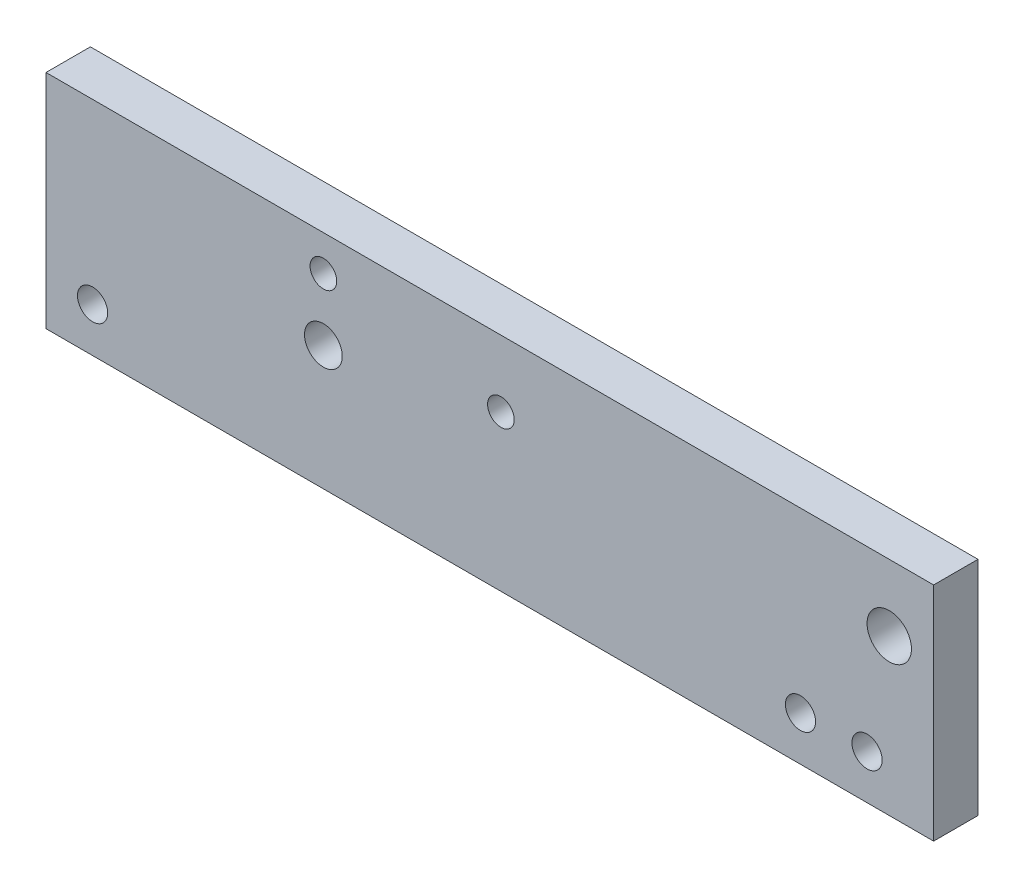
ISO-10303-21;
HEADER;
FILE_DESCRIPTION(('STEP AP214'),'2;1');
FILE_NAME('part.step','',(''),(''),'','','');
FILE_SCHEMA(('AUTOMOTIVE_DESIGN { 1 0 10303 214 1 1 1 1 }'));
ENDSEC;
DATA;
#1=APPLICATION_CONTEXT('core data for automotive mechanical design processes');
#2=APPLICATION_PROTOCOL_DEFINITION('international standard','automotive_design',2000,#1);
#3=PRODUCT_CONTEXT('',#1,'mechanical');
#4=PRODUCT('Part','Part','',(#3));
#5=PRODUCT_RELATED_PRODUCT_CATEGORY('part','',(#4));
#6=PRODUCT_DEFINITION_FORMATION('','',#4);
#7=PRODUCT_DEFINITION_CONTEXT('part definition',#1,'design');
#8=PRODUCT_DEFINITION('design','',#6,#7);
#9=PRODUCT_DEFINITION_SHAPE('','',#8);
#10=(LENGTH_UNIT() NAMED_UNIT(*) SI_UNIT(.MILLI.,.METRE.));
#11=(NAMED_UNIT(*) PLANE_ANGLE_UNIT() SI_UNIT($,.RADIAN.));
#12=(NAMED_UNIT(*) SI_UNIT($,.STERADIAN.) SOLID_ANGLE_UNIT());
#13=UNCERTAINTY_MEASURE_WITH_UNIT(LENGTH_MEASURE(1.E-05),#10,'distance_accuracy_value','');
#14=(GEOMETRIC_REPRESENTATION_CONTEXT(3) GLOBAL_UNCERTAINTY_ASSIGNED_CONTEXT((#13)) GLOBAL_UNIT_ASSIGNED_CONTEXT((#10,
#11,#12)) REPRESENTATION_CONTEXT('',''));
#15=CARTESIAN_POINT('',(0.,0.,0.));
#16=DIRECTION('',(0.,0.,1.));
#17=DIRECTION('',(1.,0.,0.));
#18=AXIS2_PLACEMENT_3D('',#15,#16,#17);
#19=CARTESIAN_POINT('',(-100.,-25.,10.));
#20=DIRECTION('',(1.,0.,0.));
#21=DIRECTION('',(0.,0.,-1.));
#22=AXIS2_PLACEMENT_3D('',#19,#20,#21);
#23=PLANE('',#22);
#24=DIRECTION('',(0.,-1.,0.));
#25=VECTOR('',#24,1.);
#26=CARTESIAN_POINT('',(-100.,-25.,0.));
#27=LINE('',#26,#25);
#28=CARTESIAN_POINT('',(-100.,25.,0.));
#29=VERTEX_POINT('',#28);
#30=CARTESIAN_POINT('',(-100.,-25.,0.));
#31=VERTEX_POINT('',#30);
#32=EDGE_CURVE('E116',#29,#31,#27,.T.);
#33=ORIENTED_EDGE('',*,*,#32,.T.);
#34=DIRECTION('',(0.,0.,-1.));
#35=VECTOR('',#34,1.);
#36=CARTESIAN_POINT('',(-100.,-25.,10.));
#37=LINE('',#36,#35);
#38=CARTESIAN_POINT('',(-100.,-25.,10.));
#39=VERTEX_POINT('',#38);
#40=EDGE_CURVE('E11',#39,#31,#37,.T.);
#41=ORIENTED_EDGE('',*,*,#40,.F.);
#42=DIRECTION('',(0.,-1.,0.));
#43=VECTOR('',#42,1.);
#44=CARTESIAN_POINT('',(-100.,-25.,10.));
#45=LINE('',#44,#43);
#46=CARTESIAN_POINT('',(-100.,25.,10.));
#47=VERTEX_POINT('',#46);
#48=EDGE_CURVE('E99',#47,#39,#45,.T.);
#49=ORIENTED_EDGE('',*,*,#48,.F.);
#50=DIRECTION('',(0.,0.,-1.));
#51=VECTOR('',#50,1.);
#52=CARTESIAN_POINT('',(-100.,25.,10.));
#53=LINE('',#52,#51);
#54=EDGE_CURVE('E112',#47,#29,#53,.T.);
#55=ORIENTED_EDGE('',*,*,#54,.T.);
#56=EDGE_LOOP('',(#33,#41,#49,#55));
#57=FACE_BOUND('',#56,.T.);
#58=ADVANCED_FACE('F47',(#57),#23,.F.);
#59=CARTESIAN_POINT('',(100.,-25.,10.));
#60=DIRECTION('',(0.,1.,0.));
#61=DIRECTION('',(-1.,0.,0.));
#62=AXIS2_PLACEMENT_3D('',#59,#60,#61);
#63=PLANE('',#62);
#64=DIRECTION('',(1.,0.,0.));
#65=VECTOR('',#64,1.);
#66=CARTESIAN_POINT('',(100.,-25.,0.));
#67=LINE('',#66,#65);
#68=CARTESIAN_POINT('',(100.,-25.,0.));
#69=VERTEX_POINT('',#68);
#70=EDGE_CURVE('E104',#31,#69,#67,.T.);
#71=ORIENTED_EDGE('',*,*,#70,.T.);
#72=DIRECTION('',(0.,0.,-1.));
#73=VECTOR('',#72,1.);
#74=CARTESIAN_POINT('',(100.,-25.,10.));
#75=LINE('',#74,#73);
#76=CARTESIAN_POINT('',(100.,-25.,10.));
#77=VERTEX_POINT('',#76);
#78=EDGE_CURVE('E56',#77,#69,#75,.T.);
#79=ORIENTED_EDGE('',*,*,#78,.F.);
#80=DIRECTION('',(1.,0.,0.));
#81=VECTOR('',#80,1.);
#82=CARTESIAN_POINT('',(100.,-25.,10.));
#83=LINE('',#82,#81);
#84=EDGE_CURVE('E94',#39,#77,#83,.T.);
#85=ORIENTED_EDGE('',*,*,#84,.F.);
#86=ORIENTED_EDGE('',*,*,#40,.T.);
#87=EDGE_LOOP('',(#71,#79,#85,#86));
#88=FACE_BOUND('',#87,.T.);
#89=ADVANCED_FACE('F103',(#88),#63,.F.);
#90=CARTESIAN_POINT('',(100.,-25.,10.));
#91=DIRECTION('',(-1.,0.,0.));
#92=DIRECTION('',(0.,0.,1.));
#93=AXIS2_PLACEMENT_3D('',#90,#91,#92);
#94=PLANE('',#93);
#95=DIRECTION('',(0.,1.,0.));
#96=VECTOR('',#95,1.);
#97=CARTESIAN_POINT('',(100.,-25.,0.));
#98=LINE('',#97,#96);
#99=CARTESIAN_POINT('',(100.,25.,0.));
#100=VERTEX_POINT('',#99);
#101=EDGE_CURVE('E81',#69,#100,#98,.T.);
#102=ORIENTED_EDGE('',*,*,#101,.T.);
#103=DIRECTION('',(0.,0.,-1.));
#104=VECTOR('',#103,1.);
#105=CARTESIAN_POINT('',(100.,25.,10.));
#106=LINE('',#105,#104);
#107=CARTESIAN_POINT('',(100.,25.,10.));
#108=VERTEX_POINT('',#107);
#109=EDGE_CURVE('E106',#108,#100,#106,.T.);
#110=ORIENTED_EDGE('',*,*,#109,.F.);
#111=DIRECTION('',(0.,1.,0.));
#112=VECTOR('',#111,1.);
#113=CARTESIAN_POINT('',(100.,-25.,10.));
#114=LINE('',#113,#112);
#115=EDGE_CURVE('E97',#77,#108,#114,.T.);
#116=ORIENTED_EDGE('',*,*,#115,.F.);
#117=ORIENTED_EDGE('',*,*,#78,.T.);
#118=EDGE_LOOP('',(#102,#110,#116,#117));
#119=FACE_BOUND('',#118,.T.);
#120=ADVANCED_FACE('F107',(#119),#94,.F.);
#121=CARTESIAN_POINT('',(100.,25.,10.));
#122=DIRECTION('',(0.,-1.,0.));
#123=DIRECTION('',(1.,0.,0.));
#124=AXIS2_PLACEMENT_3D('',#121,#122,#123);
#125=PLANE('',#124);
#126=DIRECTION('',(-1.,0.,0.));
#127=VECTOR('',#126,1.);
#128=CARTESIAN_POINT('',(100.,25.,0.));
#129=LINE('',#128,#127);
#130=EDGE_CURVE('E87',#100,#29,#129,.T.);
#131=ORIENTED_EDGE('',*,*,#130,.T.);
#132=ORIENTED_EDGE('',*,*,#54,.F.);
#133=DIRECTION('',(-1.,0.,0.));
#134=VECTOR('',#133,1.);
#135=CARTESIAN_POINT('',(100.,25.,10.));
#136=LINE('',#135,#134);
#137=EDGE_CURVE('E64',#108,#47,#136,.T.);
#138=ORIENTED_EDGE('',*,*,#137,.F.);
#139=ORIENTED_EDGE('',*,*,#109,.T.);
#140=EDGE_LOOP('',(#131,#132,#138,#139));
#141=FACE_BOUND('',#140,.T.);
#142=ADVANCED_FACE('F131',(#141),#125,.F.);
#143=CARTESIAN_POINT('',(0.,0.,10.));
#144=DIRECTION('',(0.,0.,1.));
#145=DIRECTION('',(1.,0.,0.));
#146=AXIS2_PLACEMENT_3D('',#143,#144,#145);
#147=PLANE('',#146);
#148=CARTESIAN_POINT('',(-89.5,-15.,10.));
#149=DIRECTION('',(0.,0.,1.));
#150=DIRECTION('',(1.,0.,0.));
#151=AXIS2_PLACEMENT_3D('',#148,#149,#150);
#152=CIRCLE('',#151,3.4);
#153=CARTESIAN_POINT('',(-86.1,-15.,10.));
#154=VERTEX_POINT('',#153);
#155=EDGE_CURVE('E187',#154,#154,#152,.T.);
#156=ORIENTED_EDGE('',*,*,#155,.F.);
#157=EDGE_LOOP('',(#156));
#158=FACE_BOUND('',#157,.T.);
#159=CARTESIAN_POINT('',(70.,-15.,10.));
#160=DIRECTION('',(0.,0.,1.));
#161=DIRECTION('',(1.,0.,0.));
#162=AXIS2_PLACEMENT_3D('',#159,#160,#161);
#163=CIRCLE('',#162,3.4);
#164=CARTESIAN_POINT('',(73.4,-15.,10.));
#165=VERTEX_POINT('',#164);
#166=EDGE_CURVE('E183',#165,#165,#163,.T.);
#167=ORIENTED_EDGE('',*,*,#166,.F.);
#168=EDGE_LOOP('',(#167));
#169=FACE_BOUND('',#168,.T.);
#170=CARTESIAN_POINT('',(85.,-15.,10.));
#171=DIRECTION('',(0.,0.,1.));
#172=DIRECTION('',(1.,0.,0.));
#173=AXIS2_PLACEMENT_3D('',#170,#171,#172);
#174=CIRCLE('',#173,3.4);
#175=CARTESIAN_POINT('',(88.4,-15.,10.));
#176=VERTEX_POINT('',#175);
#177=EDGE_CURVE('E175',#176,#176,#174,.T.);
#178=ORIENTED_EDGE('',*,*,#177,.F.);
#179=EDGE_LOOP('',(#178));
#180=FACE_BOUND('',#179,.T.);
#181=CARTESIAN_POINT('',(90.,10.,10.));
#182=DIRECTION('',(0.,0.,1.));
#183=DIRECTION('',(1.,0.,0.));
#184=AXIS2_PLACEMENT_3D('',#181,#182,#183);
#185=CIRCLE('',#184,5.);
#186=CARTESIAN_POINT('',(95.,10.,10.));
#187=VERTEX_POINT('',#186);
#188=EDGE_CURVE('E156',#187,#187,#185,.T.);
#189=ORIENTED_EDGE('',*,*,#188,.F.);
#190=EDGE_LOOP('',(#189));
#191=FACE_BOUND('',#190,.T.);
#192=CARTESIAN_POINT('',(-37.5,3.00000000000001,10.));
#193=DIRECTION('',(0.,0.,1.));
#194=DIRECTION('',(1.,0.,0.));
#195=AXIS2_PLACEMENT_3D('',#192,#193,#194);
#196=CIRCLE('',#195,4.25000000000001);
#197=CARTESIAN_POINT('',(-33.25,3.00000000000001,10.));
#198=VERTEX_POINT('',#197);
#199=EDGE_CURVE('E144',#198,#198,#196,.T.);
#200=ORIENTED_EDGE('',*,*,#199,.F.);
#201=EDGE_LOOP('',(#200));
#202=FACE_BOUND('',#201,.T.);
#203=CARTESIAN_POINT('',(-37.5,17.,10.));
#204=DIRECTION('',(0.,0.,1.));
#205=DIRECTION('',(1.,0.,0.));
#206=AXIS2_PLACEMENT_3D('',#203,#204,#205);
#207=CIRCLE('',#206,3.);
#208=CARTESIAN_POINT('',(-34.5,17.,10.));
#209=VERTEX_POINT('',#208);
#210=EDGE_CURVE('E143',#209,#209,#207,.T.);
#211=ORIENTED_EDGE('',*,*,#210,.F.);
#212=EDGE_LOOP('',(#211));
#213=FACE_BOUND('',#212,.T.);
#214=CARTESIAN_POINT('',(2.50000000000002,10.,10.));
#215=DIRECTION('',(0.,0.,1.));
#216=DIRECTION('',(1.,0.,0.));
#217=AXIS2_PLACEMENT_3D('',#214,#215,#216);
#218=CIRCLE('',#217,3.);
#219=CARTESIAN_POINT('',(5.50000000000002,10.,10.));
#220=VERTEX_POINT('',#219);
#221=EDGE_CURVE('E152',#220,#220,#218,.T.);
#222=ORIENTED_EDGE('',*,*,#221,.F.);
#223=EDGE_LOOP('',(#222));
#224=FACE_BOUND('',#223,.T.);
#225=ORIENTED_EDGE('',*,*,#48,.T.);
#226=ORIENTED_EDGE('',*,*,#84,.T.);
#227=ORIENTED_EDGE('',*,*,#115,.T.);
#228=ORIENTED_EDGE('',*,*,#137,.T.);
#229=EDGE_LOOP('',(#225,#226,#227,#228));
#230=FACE_BOUND('',#229,.T.);
#231=ADVANCED_FACE('F95',(#158,#169,#180,#191,#202,#213,#224,#230),#147,.T.);
#232=CARTESIAN_POINT('',(0.,0.,0.));
#233=DIRECTION('',(0.,0.,1.));
#234=DIRECTION('',(1.,0.,0.));
#235=AXIS2_PLACEMENT_3D('',#232,#233,#234);
#236=PLANE('',#235);
#237=CARTESIAN_POINT('',(-89.5,-15.,0.));
#238=DIRECTION('',(0.,0.,1.));
#239=DIRECTION('',(1.,0.,0.));
#240=AXIS2_PLACEMENT_3D('',#237,#238,#239);
#241=CIRCLE('',#240,3.4);
#242=CARTESIAN_POINT('',(-86.1,-15.,0.));
#243=VERTEX_POINT('',#242);
#244=EDGE_CURVE('E161',#243,#243,#241,.T.);
#245=ORIENTED_EDGE('',*,*,#244,.T.);
#246=EDGE_LOOP('',(#245));
#247=FACE_BOUND('',#246,.T.);
#248=CARTESIAN_POINT('',(70.,-15.,0.));
#249=DIRECTION('',(0.,0.,1.));
#250=DIRECTION('',(1.,0.,0.));
#251=AXIS2_PLACEMENT_3D('',#248,#249,#250);
#252=CIRCLE('',#251,3.4);
#253=CARTESIAN_POINT('',(73.4,-15.,0.));
#254=VERTEX_POINT('',#253);
#255=EDGE_CURVE('E179',#254,#254,#252,.T.);
#256=ORIENTED_EDGE('',*,*,#255,.T.);
#257=EDGE_LOOP('',(#256));
#258=FACE_BOUND('',#257,.T.);
#259=CARTESIAN_POINT('',(85.,-15.,0.));
#260=DIRECTION('',(0.,0.,1.));
#261=DIRECTION('',(1.,0.,0.));
#262=AXIS2_PLACEMENT_3D('',#259,#260,#261);
#263=CIRCLE('',#262,3.4);
#264=CARTESIAN_POINT('',(88.4,-15.,0.));
#265=VERTEX_POINT('',#264);
#266=EDGE_CURVE('E171',#265,#265,#263,.T.);
#267=ORIENTED_EDGE('',*,*,#266,.T.);
#268=EDGE_LOOP('',(#267));
#269=FACE_BOUND('',#268,.T.);
#270=CARTESIAN_POINT('',(90.,10.,0.));
#271=DIRECTION('',(0.,0.,1.));
#272=DIRECTION('',(1.,0.,0.));
#273=AXIS2_PLACEMENT_3D('',#270,#271,#272);
#274=CIRCLE('',#273,5.);
#275=CARTESIAN_POINT('',(95.,10.,0.));
#276=VERTEX_POINT('',#275);
#277=EDGE_CURVE('E120',#276,#276,#274,.T.);
#278=ORIENTED_EDGE('',*,*,#277,.T.);
#279=EDGE_LOOP('',(#278));
#280=FACE_BOUND('',#279,.T.);
#281=CARTESIAN_POINT('',(-37.5,3.00000000000001,0.));
#282=DIRECTION('',(0.,0.,1.));
#283=DIRECTION('',(1.,0.,0.));
#284=AXIS2_PLACEMENT_3D('',#281,#282,#283);
#285=CIRCLE('',#284,4.25000000000001);
#286=CARTESIAN_POINT('',(-33.25,3.00000000000001,0.));
#287=VERTEX_POINT('',#286);
#288=EDGE_CURVE('E157',#287,#287,#285,.T.);
#289=ORIENTED_EDGE('',*,*,#288,.T.);
#290=EDGE_LOOP('',(#289));
#291=FACE_BOUND('',#290,.T.);
#292=CARTESIAN_POINT('',(-37.5,17.,0.));
#293=DIRECTION('',(0.,0.,1.));
#294=DIRECTION('',(1.,0.,0.));
#295=AXIS2_PLACEMENT_3D('',#292,#293,#294);
#296=CIRCLE('',#295,3.);
#297=CARTESIAN_POINT('',(-34.5,17.,0.));
#298=VERTEX_POINT('',#297);
#299=EDGE_CURVE('E139',#298,#298,#296,.T.);
#300=ORIENTED_EDGE('',*,*,#299,.T.);
#301=EDGE_LOOP('',(#300));
#302=FACE_BOUND('',#301,.T.);
#303=CARTESIAN_POINT('',(2.50000000000002,10.,0.));
#304=DIRECTION('',(0.,0.,1.));
#305=DIRECTION('',(1.,0.,0.));
#306=AXIS2_PLACEMENT_3D('',#303,#304,#305);
#307=CIRCLE('',#306,3.);
#308=CARTESIAN_POINT('',(5.50000000000002,10.,0.));
#309=VERTEX_POINT('',#308);
#310=EDGE_CURVE('E148',#309,#309,#307,.T.);
#311=ORIENTED_EDGE('',*,*,#310,.T.);
#312=EDGE_LOOP('',(#311));
#313=FACE_BOUND('',#312,.T.);
#314=ORIENTED_EDGE('',*,*,#32,.F.);
#315=ORIENTED_EDGE('',*,*,#130,.F.);
#316=ORIENTED_EDGE('',*,*,#101,.F.);
#317=ORIENTED_EDGE('',*,*,#70,.F.);
#318=EDGE_LOOP('',(#314,#315,#316,#317));
#319=FACE_BOUND('',#318,.T.);
#320=ADVANCED_FACE('F134',(#247,#258,#269,#280,#291,#302,#313,#319),#236,.F.);
#321=CARTESIAN_POINT('',(2.50000000000002,10.,0.));
#322=DIRECTION('',(0.,0.,1.));
#323=DIRECTION('',(1.,0.,0.));
#324=AXIS2_PLACEMENT_3D('',#321,#322,#323);
#325=CYLINDRICAL_SURFACE('',#324,3.);
#326=ORIENTED_EDGE('',*,*,#310,.F.);
#327=EDGE_LOOP('',(#326));
#328=FACE_BOUND('',#327,.T.);
#329=ORIENTED_EDGE('',*,*,#221,.T.);
#330=EDGE_LOOP('',(#329));
#331=FACE_BOUND('',#330,.T.);
#332=ADVANCED_FACE('F220',(#328,#331),#325,.F.);
#333=CARTESIAN_POINT('',(-37.5,17.,0.));
#334=DIRECTION('',(0.,0.,1.));
#335=DIRECTION('',(1.,0.,0.));
#336=AXIS2_PLACEMENT_3D('',#333,#334,#335);
#337=CYLINDRICAL_SURFACE('',#336,3.);
#338=ORIENTED_EDGE('',*,*,#299,.F.);
#339=EDGE_LOOP('',(#338));
#340=FACE_BOUND('',#339,.T.);
#341=ORIENTED_EDGE('',*,*,#210,.T.);
#342=EDGE_LOOP('',(#341));
#343=FACE_BOUND('',#342,.T.);
#344=ADVANCED_FACE('F222',(#340,#343),#337,.F.);
#345=CARTESIAN_POINT('',(-37.5,3.00000000000001,0.));
#346=DIRECTION('',(0.,0.,1.));
#347=DIRECTION('',(1.,0.,0.));
#348=AXIS2_PLACEMENT_3D('',#345,#346,#347);
#349=CYLINDRICAL_SURFACE('',#348,4.25000000000001);
#350=ORIENTED_EDGE('',*,*,#288,.F.);
#351=EDGE_LOOP('',(#350));
#352=FACE_BOUND('',#351,.T.);
#353=ORIENTED_EDGE('',*,*,#199,.T.);
#354=EDGE_LOOP('',(#353));
#355=FACE_BOUND('',#354,.T.);
#356=ADVANCED_FACE('F229',(#352,#355),#349,.F.);
#357=CARTESIAN_POINT('',(90.,10.,0.));
#358=DIRECTION('',(0.,0.,1.));
#359=DIRECTION('',(1.,0.,0.));
#360=AXIS2_PLACEMENT_3D('',#357,#358,#359);
#361=CYLINDRICAL_SURFACE('',#360,5.);
#362=ORIENTED_EDGE('',*,*,#277,.F.);
#363=EDGE_LOOP('',(#362));
#364=FACE_BOUND('',#363,.T.);
#365=ORIENTED_EDGE('',*,*,#188,.T.);
#366=EDGE_LOOP('',(#365));
#367=FACE_BOUND('',#366,.T.);
#368=ADVANCED_FACE('F277',(#364,#367),#361,.F.);
#369=CARTESIAN_POINT('',(85.,-15.,0.));
#370=DIRECTION('',(0.,0.,1.));
#371=DIRECTION('',(1.,0.,0.));
#372=AXIS2_PLACEMENT_3D('',#369,#370,#371);
#373=CYLINDRICAL_SURFACE('',#372,3.4);
#374=ORIENTED_EDGE('',*,*,#266,.F.);
#375=EDGE_LOOP('',(#374));
#376=FACE_BOUND('',#375,.T.);
#377=ORIENTED_EDGE('',*,*,#177,.T.);
#378=EDGE_LOOP('',(#377));
#379=FACE_BOUND('',#378,.T.);
#380=ADVANCED_FACE('F272',(#376,#379),#373,.F.);
#381=CARTESIAN_POINT('',(70.,-15.,0.));
#382=DIRECTION('',(0.,0.,1.));
#383=DIRECTION('',(1.,0.,0.));
#384=AXIS2_PLACEMENT_3D('',#381,#382,#383);
#385=CYLINDRICAL_SURFACE('',#384,3.4);
#386=ORIENTED_EDGE('',*,*,#255,.F.);
#387=EDGE_LOOP('',(#386));
#388=FACE_BOUND('',#387,.T.);
#389=ORIENTED_EDGE('',*,*,#166,.T.);
#390=EDGE_LOOP('',(#389));
#391=FACE_BOUND('',#390,.T.);
#392=ADVANCED_FACE('F201',(#388,#391),#385,.F.);
#393=CARTESIAN_POINT('',(-89.5,-15.,0.));
#394=DIRECTION('',(0.,0.,1.));
#395=DIRECTION('',(1.,0.,0.));
#396=AXIS2_PLACEMENT_3D('',#393,#394,#395);
#397=CYLINDRICAL_SURFACE('',#396,3.4);
#398=ORIENTED_EDGE('',*,*,#244,.F.);
#399=EDGE_LOOP('',(#398));
#400=FACE_BOUND('',#399,.T.);
#401=ORIENTED_EDGE('',*,*,#155,.T.);
#402=EDGE_LOOP('',(#401));
#403=FACE_BOUND('',#402,.T.);
#404=ADVANCED_FACE('F198',(#400,#403),#397,.F.);
#405=CLOSED_SHELL('',(#58,#89,#120,#142,#231,#320,#332,#344,#356,#368,#380,#392,#404));
#406=MANIFOLD_SOLID_BREP('B2',#405);
#407=ADVANCED_BREP_SHAPE_REPRESENTATION('',(#18,#406),#14);
#408=SHAPE_DEFINITION_REPRESENTATION(#9,#407);
ENDSEC;
END-ISO-10303-21;
